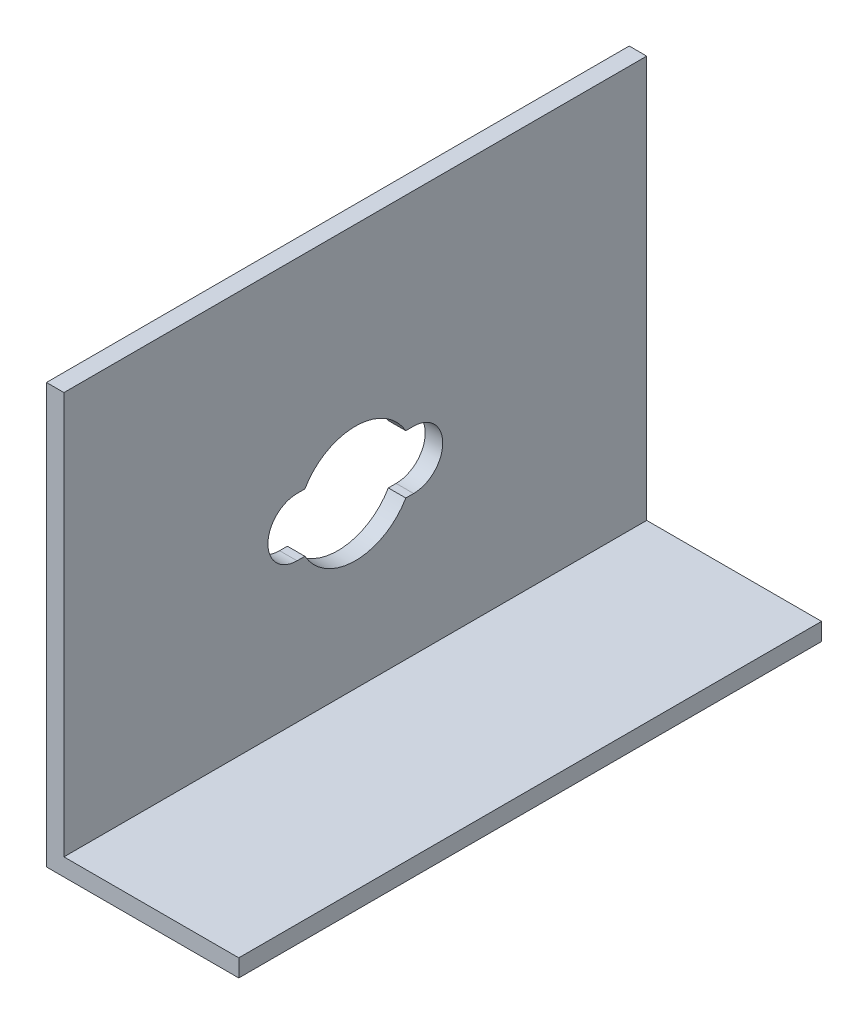
ISO-10303-21;
HEADER;
FILE_DESCRIPTION(('STEP AP214'),'2;1');
FILE_NAME('part.step','',(''),(''),'','','');
FILE_SCHEMA(('AUTOMOTIVE_DESIGN { 1 0 10303 214 1 1 1 1 }'));
ENDSEC;
DATA;
#1=APPLICATION_CONTEXT('core data for automotive mechanical design processes');
#2=APPLICATION_PROTOCOL_DEFINITION('international standard','automotive_design',2000,#1);
#3=PRODUCT_CONTEXT('',#1,'mechanical');
#4=PRODUCT('Part','Part','',(#3));
#5=PRODUCT_RELATED_PRODUCT_CATEGORY('part','',(#4));
#6=PRODUCT_DEFINITION_FORMATION('','',#4);
#7=PRODUCT_DEFINITION_CONTEXT('part definition',#1,'design');
#8=PRODUCT_DEFINITION('design','',#6,#7);
#9=PRODUCT_DEFINITION_SHAPE('','',#8);
#10=(LENGTH_UNIT() NAMED_UNIT(*) SI_UNIT(.MILLI.,.METRE.));
#11=(NAMED_UNIT(*) PLANE_ANGLE_UNIT() SI_UNIT($,.RADIAN.));
#12=(NAMED_UNIT(*) SI_UNIT($,.STERADIAN.) SOLID_ANGLE_UNIT());
#13=UNCERTAINTY_MEASURE_WITH_UNIT(LENGTH_MEASURE(1.E-05),#10,'distance_accuracy_value','');
#14=(GEOMETRIC_REPRESENTATION_CONTEXT(3) GLOBAL_UNCERTAINTY_ASSIGNED_CONTEXT((#13)) GLOBAL_UNIT_ASSIGNED_CONTEXT((#10,
#11,#12)) REPRESENTATION_CONTEXT('',''));
#15=CARTESIAN_POINT('',(0.,0.,0.));
#16=DIRECTION('',(0.,0.,1.));
#17=DIRECTION('',(1.,0.,0.));
#18=AXIS2_PLACEMENT_3D('',#15,#16,#17);
#19=CARTESIAN_POINT('',(3.00000000000001,3.,100.));
#20=DIRECTION('',(-1.,0.,0.));
#21=DIRECTION('',(0.,-1.,0.));
#22=AXIS2_PLACEMENT_3D('',#19,#20,#21);
#23=PLANE('',#22);
#24=DIRECTION('',(0.,0.,-1.));
#25=VECTOR('',#24,1.);
#26=CARTESIAN_POINT('',(3.00000000000001,37.0000000000003,99.9999999999998));
#27=LINE('',#26,#25);
#28=CARTESIAN_POINT('',(3.,37.,41.3397459621556));
#29=VERTEX_POINT('',#28);
#30=CARTESIAN_POINT('',(3.,37.,40.));
#31=VERTEX_POINT('',#30);
#32=EDGE_CURVE('E225',#29,#31,#27,.T.);
#33=ORIENTED_EDGE('',*,*,#32,.T.);
#34=CARTESIAN_POINT('',(3.,32.,40.));
#35=DIRECTION('',(-1.,0.,0.));
#36=DIRECTION('',(0.,-1.,0.));
#37=AXIS2_PLACEMENT_3D('',#34,#35,#36);
#38=CIRCLE('',#37,5.);
#39=CARTESIAN_POINT('',(3.,27.,40.));
#40=VERTEX_POINT('',#39);
#41=EDGE_CURVE('E229',#31,#40,#38,.T.);
#42=ORIENTED_EDGE('',*,*,#41,.T.);
#43=DIRECTION('',(0.,0.,1.));
#44=VECTOR('',#43,1.);
#45=CARTESIAN_POINT('',(3.00000000000001,26.9999999999998,100.));
#46=LINE('',#45,#44);
#47=CARTESIAN_POINT('',(3.00000000000001,27.,41.3397459621556));
#48=VERTEX_POINT('',#47);
#49=EDGE_CURVE('E188',#40,#48,#46,.T.);
#50=ORIENTED_EDGE('',*,*,#49,.T.);
#51=CARTESIAN_POINT('',(3.,32.,50.));
#52=DIRECTION('',(-1.,0.,0.));
#53=DIRECTION('',(0.,-1.,0.));
#54=AXIS2_PLACEMENT_3D('',#51,#52,#53);
#55=CIRCLE('',#54,10.);
#56=CARTESIAN_POINT('',(3.,27.,58.6602540378443));
#57=VERTEX_POINT('',#56);
#58=EDGE_CURVE('E146',#48,#57,#55,.T.);
#59=ORIENTED_EDGE('',*,*,#58,.T.);
#60=DIRECTION('',(0.,0.,1.));
#61=VECTOR('',#60,1.);
#62=CARTESIAN_POINT('',(3.00000000000001,27.0000000000001,99.9999999999999));
#63=LINE('',#62,#61);
#64=CARTESIAN_POINT('',(3.,27.,60.));
#65=VERTEX_POINT('',#64);
#66=EDGE_CURVE('E209',#57,#65,#63,.T.);
#67=ORIENTED_EDGE('',*,*,#66,.T.);
#68=CARTESIAN_POINT('',(3.,32.,60.));
#69=DIRECTION('',(-1.,0.,0.));
#70=DIRECTION('',(0.,-1.,0.));
#71=AXIS2_PLACEMENT_3D('',#68,#69,#70);
#72=CIRCLE('',#71,5.);
#73=CARTESIAN_POINT('',(3.,37.,59.9999999999999));
#74=VERTEX_POINT('',#73);
#75=EDGE_CURVE('E213',#65,#74,#72,.T.);
#76=ORIENTED_EDGE('',*,*,#75,.T.);
#77=DIRECTION('',(0.,0.,-1.));
#78=VECTOR('',#77,1.);
#79=CARTESIAN_POINT('',(3.00000000000001,36.9999999999998,100.));
#80=LINE('',#79,#78);
#81=CARTESIAN_POINT('',(3.,37.,58.6602540378443));
#82=VERTEX_POINT('',#81);
#83=EDGE_CURVE('E217',#74,#82,#80,.T.);
#84=ORIENTED_EDGE('',*,*,#83,.T.);
#85=CARTESIAN_POINT('',(3.,32.,50.));
#86=DIRECTION('',(-1.,0.,0.));
#87=DIRECTION('',(0.,-1.,0.));
#88=AXIS2_PLACEMENT_3D('',#85,#86,#87);
#89=CIRCLE('',#88,10.);
#90=EDGE_CURVE('E221',#82,#29,#89,.T.);
#91=ORIENTED_EDGE('',*,*,#90,.T.);
#92=EDGE_LOOP('',(#33,#42,#50,#59,#67,#76,#84,#91));
#93=FACE_BOUND('',#92,.T.);
#94=DIRECTION('',(0.,1.,0.));
#95=VECTOR('',#94,1.);
#96=CARTESIAN_POINT('',(3.00000000000001,3.,0.));
#97=LINE('',#96,#95);
#98=CARTESIAN_POINT('',(3.00000000000001,3.,0.));
#99=VERTEX_POINT('',#98);
#100=CARTESIAN_POINT('',(3.00000000000001,72.,0.));
#101=VERTEX_POINT('',#100);
#102=EDGE_CURVE('E233',#99,#101,#97,.T.);
#103=ORIENTED_EDGE('',*,*,#102,.T.);
#104=DIRECTION('',(0.,0.,-1.));
#105=VECTOR('',#104,1.);
#106=CARTESIAN_POINT('',(3.00000000000001,72.,100.));
#107=LINE('',#106,#105);
#108=CARTESIAN_POINT('',(3.00000000000001,72.,100.));
#109=VERTEX_POINT('',#108);
#110=EDGE_CURVE('E11',#109,#101,#107,.T.);
#111=ORIENTED_EDGE('',*,*,#110,.F.);
#112=DIRECTION('',(0.,1.,0.));
#113=VECTOR('',#112,1.);
#114=CARTESIAN_POINT('',(3.00000000000001,3.,100.));
#115=LINE('',#114,#113);
#116=CARTESIAN_POINT('',(3.00000000000001,3.,100.));
#117=VERTEX_POINT('',#116);
#118=EDGE_CURVE('E234',#117,#109,#115,.T.);
#119=ORIENTED_EDGE('',*,*,#118,.F.);
#120=DIRECTION('',(0.,0.,-1.));
#121=VECTOR('',#120,1.);
#122=CARTESIAN_POINT('',(3.00000000000001,3.,100.));
#123=LINE('',#122,#121);
#124=EDGE_CURVE('E254',#117,#99,#123,.T.);
#125=ORIENTED_EDGE('',*,*,#124,.T.);
#126=EDGE_LOOP('',(#103,#111,#119,#125));
#127=FACE_BOUND('',#126,.T.);
#128=ADVANCED_FACE('F39',(#93,#127),#23,.F.);
#129=CARTESIAN_POINT('',(0.,72.,100.));
#130=DIRECTION('',(0.,-1.,0.));
#131=DIRECTION('',(0.,0.,-1.));
#132=AXIS2_PLACEMENT_3D('',#129,#130,#131);
#133=PLANE('',#132);
#134=DIRECTION('',(-1.,0.,0.));
#135=VECTOR('',#134,1.);
#136=CARTESIAN_POINT('',(0.,72.,0.));
#137=LINE('',#136,#135);
#138=CARTESIAN_POINT('',(0.,72.,0.));
#139=VERTEX_POINT('',#138);
#140=EDGE_CURVE('E258',#101,#139,#137,.T.);
#141=ORIENTED_EDGE('',*,*,#140,.T.);
#142=DIRECTION('',(0.,0.,-1.));
#143=VECTOR('',#142,1.);
#144=CARTESIAN_POINT('',(0.,72.,100.));
#145=LINE('',#144,#143);
#146=CARTESIAN_POINT('',(0.,72.,100.));
#147=VERTEX_POINT('',#146);
#148=EDGE_CURVE('E47',#147,#139,#145,.T.);
#149=ORIENTED_EDGE('',*,*,#148,.F.);
#150=DIRECTION('',(-1.,0.,0.));
#151=VECTOR('',#150,1.);
#152=CARTESIAN_POINT('',(0.,72.,100.));
#153=LINE('',#152,#151);
#154=EDGE_CURVE('E238',#109,#147,#153,.T.);
#155=ORIENTED_EDGE('',*,*,#154,.F.);
#156=ORIENTED_EDGE('',*,*,#110,.T.);
#157=EDGE_LOOP('',(#141,#149,#155,#156));
#158=FACE_BOUND('',#157,.T.);
#159=ADVANCED_FACE('F313',(#158),#133,.F.);
#160=CARTESIAN_POINT('',(0.,72.,100.));
#161=DIRECTION('',(1.,0.,0.));
#162=DIRECTION('',(0.,1.,0.));
#163=AXIS2_PLACEMENT_3D('',#160,#161,#162);
#164=PLANE('',#163);
#165=DIRECTION('',(0.,0.,1.));
#166=VECTOR('',#165,1.);
#167=CARTESIAN_POINT('',(0.,27.,40.));
#168=LINE('',#167,#166);
#169=CARTESIAN_POINT('',(0.,27.,40.));
#170=VERTEX_POINT('',#169);
#171=CARTESIAN_POINT('',(0.,27.,41.3397459621556));
#172=VERTEX_POINT('',#171);
#173=EDGE_CURVE('E153',#170,#172,#168,.T.);
#174=ORIENTED_EDGE('',*,*,#173,.F.);
#175=CARTESIAN_POINT('',(0.,32.,40.));
#176=DIRECTION('',(-1.,0.,0.));
#177=DIRECTION('',(0.,-1.,0.));
#178=AXIS2_PLACEMENT_3D('',#175,#176,#177);
#179=CIRCLE('',#178,5.);
#180=CARTESIAN_POINT('',(0.,37.,40.));
#181=VERTEX_POINT('',#180);
#182=EDGE_CURVE('E62',#181,#170,#179,.T.);
#183=ORIENTED_EDGE('',*,*,#182,.F.);
#184=DIRECTION('',(0.,0.,-1.));
#185=VECTOR('',#184,1.);
#186=CARTESIAN_POINT('',(0.,37.,40.));
#187=LINE('',#186,#185);
#188=CARTESIAN_POINT('',(0.,37.,41.3397459621556));
#189=VERTEX_POINT('',#188);
#190=EDGE_CURVE('E181',#189,#181,#187,.T.);
#191=ORIENTED_EDGE('',*,*,#190,.F.);
#192=CARTESIAN_POINT('',(0.,32.,50.));
#193=DIRECTION('',(-1.,0.,0.));
#194=DIRECTION('',(0.,-1.,0.));
#195=AXIS2_PLACEMENT_3D('',#192,#193,#194);
#196=CIRCLE('',#195,10.);
#197=CARTESIAN_POINT('',(0.,37.,58.6602540378443));
#198=VERTEX_POINT('',#197);
#199=EDGE_CURVE('E177',#198,#189,#196,.T.);
#200=ORIENTED_EDGE('',*,*,#199,.F.);
#201=DIRECTION('',(0.,0.,-1.));
#202=VECTOR('',#201,1.);
#203=CARTESIAN_POINT('',(0.,37.,58.6602540378443));
#204=LINE('',#203,#202);
#205=CARTESIAN_POINT('',(0.,37.,59.9999999999999));
#206=VERTEX_POINT('',#205);
#207=EDGE_CURVE('E173',#206,#198,#204,.T.);
#208=ORIENTED_EDGE('',*,*,#207,.F.);
#209=CARTESIAN_POINT('',(0.,32.,60.));
#210=DIRECTION('',(-1.,0.,0.));
#211=DIRECTION('',(0.,-1.,0.));
#212=AXIS2_PLACEMENT_3D('',#209,#210,#211);
#213=CIRCLE('',#212,5.);
#214=CARTESIAN_POINT('',(0.,27.,60.));
#215=VERTEX_POINT('',#214);
#216=EDGE_CURVE('E166',#215,#206,#213,.T.);
#217=ORIENTED_EDGE('',*,*,#216,.F.);
#218=DIRECTION('',(0.,0.,1.));
#219=VECTOR('',#218,1.);
#220=CARTESIAN_POINT('',(0.,27.,58.6602540378443));
#221=LINE('',#220,#219);
#222=CARTESIAN_POINT('',(0.,27.,58.6602540378443));
#223=VERTEX_POINT('',#222);
#224=EDGE_CURVE('E162',#223,#215,#221,.T.);
#225=ORIENTED_EDGE('',*,*,#224,.F.);
#226=CARTESIAN_POINT('',(0.,32.,50.));
#227=DIRECTION('',(-1.,0.,0.));
#228=DIRECTION('',(0.,-1.,0.));
#229=AXIS2_PLACEMENT_3D('',#226,#227,#228);
#230=CIRCLE('',#229,10.);
#231=EDGE_CURVE('E143',#172,#223,#230,.T.);
#232=ORIENTED_EDGE('',*,*,#231,.F.);
#233=EDGE_LOOP('',(#174,#183,#191,#200,#208,#217,#225,#232));
#234=FACE_BOUND('',#233,.T.);
#235=DIRECTION('',(0.,-1.,0.));
#236=VECTOR('',#235,1.);
#237=CARTESIAN_POINT('',(0.,72.,0.));
#238=LINE('',#237,#236);
#239=CARTESIAN_POINT('',(0.,0.,0.));
#240=VERTEX_POINT('',#239);
#241=EDGE_CURVE('E261',#139,#240,#238,.T.);
#242=ORIENTED_EDGE('',*,*,#241,.T.);
#243=DIRECTION('',(0.,0.,-1.));
#244=VECTOR('',#243,1.);
#245=CARTESIAN_POINT('',(0.,0.,100.));
#246=LINE('',#245,#244);
#247=CARTESIAN_POINT('',(0.,0.,100.));
#248=VERTEX_POINT('',#247);
#249=EDGE_CURVE('E283',#248,#240,#246,.T.);
#250=ORIENTED_EDGE('',*,*,#249,.F.);
#251=DIRECTION('',(0.,-1.,0.));
#252=VECTOR('',#251,1.);
#253=CARTESIAN_POINT('',(0.,72.,100.));
#254=LINE('',#253,#252);
#255=EDGE_CURVE('E242',#147,#248,#254,.T.);
#256=ORIENTED_EDGE('',*,*,#255,.F.);
#257=ORIENTED_EDGE('',*,*,#148,.T.);
#258=EDGE_LOOP('',(#242,#250,#256,#257));
#259=FACE_BOUND('',#258,.T.);
#260=ADVANCED_FACE('F158',(#234,#259),#164,.F.);
#261=CARTESIAN_POINT('',(0.,0.,100.));
#262=DIRECTION('',(0.,1.,0.));
#263=DIRECTION('',(0.,0.,1.));
#264=AXIS2_PLACEMENT_3D('',#261,#262,#263);
#265=PLANE('',#264);
#266=DIRECTION('',(1.,0.,0.));
#267=VECTOR('',#266,1.);
#268=CARTESIAN_POINT('',(0.,0.,0.));
#269=LINE('',#268,#267);
#270=CARTESIAN_POINT('',(33.,0.,0.));
#271=VERTEX_POINT('',#270);
#272=EDGE_CURVE('E264',#240,#271,#269,.T.);
#273=ORIENTED_EDGE('',*,*,#272,.T.);
#274=DIRECTION('',(0.,0.,-1.));
#275=VECTOR('',#274,1.);
#276=CARTESIAN_POINT('',(33.,0.,100.));
#277=LINE('',#276,#275);
#278=CARTESIAN_POINT('',(33.,0.,100.));
#279=VERTEX_POINT('',#278);
#280=EDGE_CURVE('E279',#279,#271,#277,.T.);
#281=ORIENTED_EDGE('',*,*,#280,.F.);
#282=DIRECTION('',(1.,0.,0.));
#283=VECTOR('',#282,1.);
#284=CARTESIAN_POINT('',(0.,0.,100.));
#285=LINE('',#284,#283);
#286=EDGE_CURVE('E245',#248,#279,#285,.T.);
#287=ORIENTED_EDGE('',*,*,#286,.F.);
#288=ORIENTED_EDGE('',*,*,#249,.T.);
#289=EDGE_LOOP('',(#273,#281,#287,#288));
#290=FACE_BOUND('',#289,.T.);
#291=ADVANCED_FACE('F301',(#290),#265,.F.);
#292=CARTESIAN_POINT('',(33.,0.,100.));
#293=DIRECTION('',(-1.,0.,0.));
#294=DIRECTION('',(0.,0.,1.));
#295=AXIS2_PLACEMENT_3D('',#292,#293,#294);
#296=PLANE('',#295);
#297=DIRECTION('',(0.,1.,0.));
#298=VECTOR('',#297,1.);
#299=CARTESIAN_POINT('',(33.,0.,0.));
#300=LINE('',#299,#298);
#301=CARTESIAN_POINT('',(33.,3.,0.));
#302=VERTEX_POINT('',#301);
#303=EDGE_CURVE('E267',#271,#302,#300,.T.);
#304=ORIENTED_EDGE('',*,*,#303,.T.);
#305=DIRECTION('',(0.,0.,-1.));
#306=VECTOR('',#305,1.);
#307=CARTESIAN_POINT('',(33.,3.,100.));
#308=LINE('',#307,#306);
#309=CARTESIAN_POINT('',(33.,3.,100.));
#310=VERTEX_POINT('',#309);
#311=EDGE_CURVE('E275',#310,#302,#308,.T.);
#312=ORIENTED_EDGE('',*,*,#311,.F.);
#313=DIRECTION('',(0.,1.,0.));
#314=VECTOR('',#313,1.);
#315=CARTESIAN_POINT('',(33.,0.,100.));
#316=LINE('',#315,#314);
#317=EDGE_CURVE('E248',#279,#310,#316,.T.);
#318=ORIENTED_EDGE('',*,*,#317,.F.);
#319=ORIENTED_EDGE('',*,*,#280,.T.);
#320=EDGE_LOOP('',(#304,#312,#318,#319));
#321=FACE_BOUND('',#320,.T.);
#322=ADVANCED_FACE('F305',(#321),#296,.F.);
#323=CARTESIAN_POINT('',(33.,3.,100.));
#324=DIRECTION('',(0.,-1.,0.));
#325=DIRECTION('',(0.,0.,-1.));
#326=AXIS2_PLACEMENT_3D('',#323,#324,#325);
#327=PLANE('',#326);
#328=DIRECTION('',(-1.,0.,0.));
#329=VECTOR('',#328,1.);
#330=CARTESIAN_POINT('',(33.,3.,0.));
#331=LINE('',#330,#329);
#332=EDGE_CURVE('E239',#302,#99,#331,.T.);
#333=ORIENTED_EDGE('',*,*,#332,.T.);
#334=ORIENTED_EDGE('',*,*,#124,.F.);
#335=DIRECTION('',(-1.,0.,0.));
#336=VECTOR('',#335,1.);
#337=CARTESIAN_POINT('',(33.,3.,100.));
#338=LINE('',#337,#336);
#339=EDGE_CURVE('E251',#310,#117,#338,.T.);
#340=ORIENTED_EDGE('',*,*,#339,.F.);
#341=ORIENTED_EDGE('',*,*,#311,.T.);
#342=EDGE_LOOP('',(#333,#334,#340,#341));
#343=FACE_BOUND('',#342,.T.);
#344=ADVANCED_FACE('F316',(#343),#327,.F.);
#345=CARTESIAN_POINT('',(0.,0.,100.));
#346=DIRECTION('',(0.,0.,-1.));
#347=DIRECTION('',(-1.,0.,0.));
#348=AXIS2_PLACEMENT_3D('',#345,#346,#347);
#349=PLANE('',#348);
#350=ORIENTED_EDGE('',*,*,#118,.T.);
#351=ORIENTED_EDGE('',*,*,#154,.T.);
#352=ORIENTED_EDGE('',*,*,#255,.T.);
#353=ORIENTED_EDGE('',*,*,#286,.T.);
#354=ORIENTED_EDGE('',*,*,#317,.T.);
#355=ORIENTED_EDGE('',*,*,#339,.T.);
#356=EDGE_LOOP('',(#350,#351,#352,#353,#354,#355));
#357=FACE_BOUND('',#356,.T.);
#358=ADVANCED_FACE('F309',(#357),#349,.F.);
#359=CARTESIAN_POINT('',(0.,0.,0.));
#360=DIRECTION('',(0.,0.,-1.));
#361=DIRECTION('',(-1.,0.,0.));
#362=AXIS2_PLACEMENT_3D('',#359,#360,#361);
#363=PLANE('',#362);
#364=ORIENTED_EDGE('',*,*,#102,.F.);
#365=ORIENTED_EDGE('',*,*,#332,.F.);
#366=ORIENTED_EDGE('',*,*,#303,.F.);
#367=ORIENTED_EDGE('',*,*,#272,.F.);
#368=ORIENTED_EDGE('',*,*,#241,.F.);
#369=ORIENTED_EDGE('',*,*,#140,.F.);
#370=EDGE_LOOP('',(#364,#365,#366,#367,#368,#369));
#371=FACE_BOUND('',#370,.T.);
#372=ADVANCED_FACE('F296',(#371),#363,.T.);
#373=CARTESIAN_POINT('',(100.,32.,40.));
#374=DIRECTION('',(-1.,0.,0.));
#375=DIRECTION('',(0.,-1.,0.));
#376=AXIS2_PLACEMENT_3D('',#373,#374,#375);
#377=CYLINDRICAL_SURFACE('',#376,5.);
#378=DIRECTION('',(-1.,0.,0.));
#379=VECTOR('',#378,1.);
#380=CARTESIAN_POINT('',(100.,37.,40.));
#381=LINE('',#380,#379);
#382=EDGE_CURVE('E185',#31,#181,#381,.T.);
#383=ORIENTED_EDGE('',*,*,#382,.T.);
#384=ORIENTED_EDGE('',*,*,#182,.T.);
#385=DIRECTION('',(-1.,0.,0.));
#386=VECTOR('',#385,1.);
#387=CARTESIAN_POINT('',(100.,27.,40.));
#388=LINE('',#387,#386);
#389=EDGE_CURVE('E150',#40,#170,#388,.T.);
#390=ORIENTED_EDGE('',*,*,#389,.F.);
#391=ORIENTED_EDGE('',*,*,#41,.F.);
#392=EDGE_LOOP('',(#383,#384,#390,#391));
#393=FACE_BOUND('',#392,.T.);
#394=ADVANCED_FACE('F350',(#393),#377,.F.);
#395=CARTESIAN_POINT('',(100.,37.,40.));
#396=DIRECTION('',(0.,1.,0.));
#397=DIRECTION('',(0.,0.,1.));
#398=AXIS2_PLACEMENT_3D('',#395,#396,#397);
#399=PLANE('',#398);
#400=DIRECTION('',(-1.,0.,0.));
#401=VECTOR('',#400,1.);
#402=CARTESIAN_POINT('',(100.,37.,41.3397459621556));
#403=LINE('',#402,#401);
#404=EDGE_CURVE('E189',#29,#189,#403,.T.);
#405=ORIENTED_EDGE('',*,*,#404,.T.);
#406=ORIENTED_EDGE('',*,*,#190,.T.);
#407=ORIENTED_EDGE('',*,*,#382,.F.);
#408=ORIENTED_EDGE('',*,*,#32,.F.);
#409=EDGE_LOOP('',(#405,#406,#407,#408));
#410=FACE_BOUND('',#409,.T.);
#411=ADVANCED_FACE('F334',(#410),#399,.F.);
#412=CARTESIAN_POINT('',(100.,32.,50.));
#413=DIRECTION('',(-1.,0.,0.));
#414=DIRECTION('',(0.,-1.,0.));
#415=AXIS2_PLACEMENT_3D('',#412,#413,#414);
#416=CYLINDRICAL_SURFACE('',#415,10.);
#417=DIRECTION('',(-1.,0.,0.));
#418=VECTOR('',#417,1.);
#419=CARTESIAN_POINT('',(100.,37.,58.6602540378443));
#420=LINE('',#419,#418);
#421=EDGE_CURVE('E192',#82,#198,#420,.T.);
#422=ORIENTED_EDGE('',*,*,#421,.T.);
#423=ORIENTED_EDGE('',*,*,#199,.T.);
#424=ORIENTED_EDGE('',*,*,#404,.F.);
#425=ORIENTED_EDGE('',*,*,#90,.F.);
#426=EDGE_LOOP('',(#422,#423,#424,#425));
#427=FACE_BOUND('',#426,.T.);
#428=ADVANCED_FACE('F336',(#427),#416,.F.);
#429=CARTESIAN_POINT('',(100.,37.,58.6602540378443));
#430=DIRECTION('',(0.,1.,0.));
#431=DIRECTION('',(0.,0.,1.));
#432=AXIS2_PLACEMENT_3D('',#429,#430,#431);
#433=PLANE('',#432);
#434=DIRECTION('',(-1.,0.,0.));
#435=VECTOR('',#434,1.);
#436=CARTESIAN_POINT('',(100.,37.,59.9999999999999));
#437=LINE('',#436,#435);
#438=EDGE_CURVE('E195',#74,#206,#437,.T.);
#439=ORIENTED_EDGE('',*,*,#438,.T.);
#440=ORIENTED_EDGE('',*,*,#207,.T.);
#441=ORIENTED_EDGE('',*,*,#421,.F.);
#442=ORIENTED_EDGE('',*,*,#83,.F.);
#443=EDGE_LOOP('',(#439,#440,#441,#442));
#444=FACE_BOUND('',#443,.T.);
#445=ADVANCED_FACE('F343',(#444),#433,.F.);
#446=CARTESIAN_POINT('',(100.,32.,60.));
#447=DIRECTION('',(-1.,0.,0.));
#448=DIRECTION('',(0.,-1.,0.));
#449=AXIS2_PLACEMENT_3D('',#446,#447,#448);
#450=CYLINDRICAL_SURFACE('',#449,5.);
#451=DIRECTION('',(-1.,0.,0.));
#452=VECTOR('',#451,1.);
#453=CARTESIAN_POINT('',(100.,27.,60.));
#454=LINE('',#453,#452);
#455=EDGE_CURVE('E198',#65,#215,#454,.T.);
#456=ORIENTED_EDGE('',*,*,#455,.T.);
#457=ORIENTED_EDGE('',*,*,#216,.T.);
#458=ORIENTED_EDGE('',*,*,#438,.F.);
#459=ORIENTED_EDGE('',*,*,#75,.F.);
#460=EDGE_LOOP('',(#456,#457,#458,#459));
#461=FACE_BOUND('',#460,.T.);
#462=ADVANCED_FACE('F346',(#461),#450,.F.);
#463=CARTESIAN_POINT('',(100.,27.,58.6602540378443));
#464=DIRECTION('',(0.,-1.,0.));
#465=DIRECTION('',(0.,0.,-1.));
#466=AXIS2_PLACEMENT_3D('',#463,#464,#465);
#467=PLANE('',#466);
#468=DIRECTION('',(-1.,0.,0.));
#469=VECTOR('',#468,1.);
#470=CARTESIAN_POINT('',(100.,27.,58.6602540378443));
#471=LINE('',#470,#469);
#472=EDGE_CURVE('E149',#57,#223,#471,.T.);
#473=ORIENTED_EDGE('',*,*,#472,.T.);
#474=ORIENTED_EDGE('',*,*,#224,.T.);
#475=ORIENTED_EDGE('',*,*,#455,.F.);
#476=ORIENTED_EDGE('',*,*,#66,.F.);
#477=EDGE_LOOP('',(#473,#474,#475,#476));
#478=FACE_BOUND('',#477,.T.);
#479=ADVANCED_FACE('F349',(#478),#467,.F.);
#480=CARTESIAN_POINT('',(100.,32.,50.));
#481=DIRECTION('',(-1.,0.,0.));
#482=DIRECTION('',(0.,-1.,0.));
#483=AXIS2_PLACEMENT_3D('',#480,#481,#482);
#484=CYLINDRICAL_SURFACE('',#483,10.);
#485=DIRECTION('',(-1.,0.,0.));
#486=VECTOR('',#485,1.);
#487=CARTESIAN_POINT('',(100.,27.,41.3397459621556));
#488=LINE('',#487,#486);
#489=EDGE_CURVE('E54',#48,#172,#488,.T.);
#490=ORIENTED_EDGE('',*,*,#489,.T.);
#491=ORIENTED_EDGE('',*,*,#231,.T.);
#492=ORIENTED_EDGE('',*,*,#472,.F.);
#493=ORIENTED_EDGE('',*,*,#58,.F.);
#494=EDGE_LOOP('',(#490,#491,#492,#493));
#495=FACE_BOUND('',#494,.T.);
#496=ADVANCED_FACE('F140',(#495),#484,.F.);
#497=CARTESIAN_POINT('',(100.,27.,40.));
#498=DIRECTION('',(0.,-1.,0.));
#499=DIRECTION('',(0.,0.,-1.));
#500=AXIS2_PLACEMENT_3D('',#497,#498,#499);
#501=PLANE('',#500);
#502=ORIENTED_EDGE('',*,*,#389,.T.);
#503=ORIENTED_EDGE('',*,*,#173,.T.);
#504=ORIENTED_EDGE('',*,*,#489,.F.);
#505=ORIENTED_EDGE('',*,*,#49,.F.);
#506=EDGE_LOOP('',(#502,#503,#504,#505));
#507=FACE_BOUND('',#506,.T.);
#508=ADVANCED_FACE('F154',(#507),#501,.F.);
#509=CLOSED_SHELL('',(#128,#159,#260,#291,#322,#344,#358,#372,#394,#411,#428,#445,#462,#479,
#496,#508));
#510=MANIFOLD_SOLID_BREP('B2',#509);
#511=ADVANCED_BREP_SHAPE_REPRESENTATION('',(#18,#510),#14);
#512=SHAPE_DEFINITION_REPRESENTATION(#9,#511);
ENDSEC;
END-ISO-10303-21;
